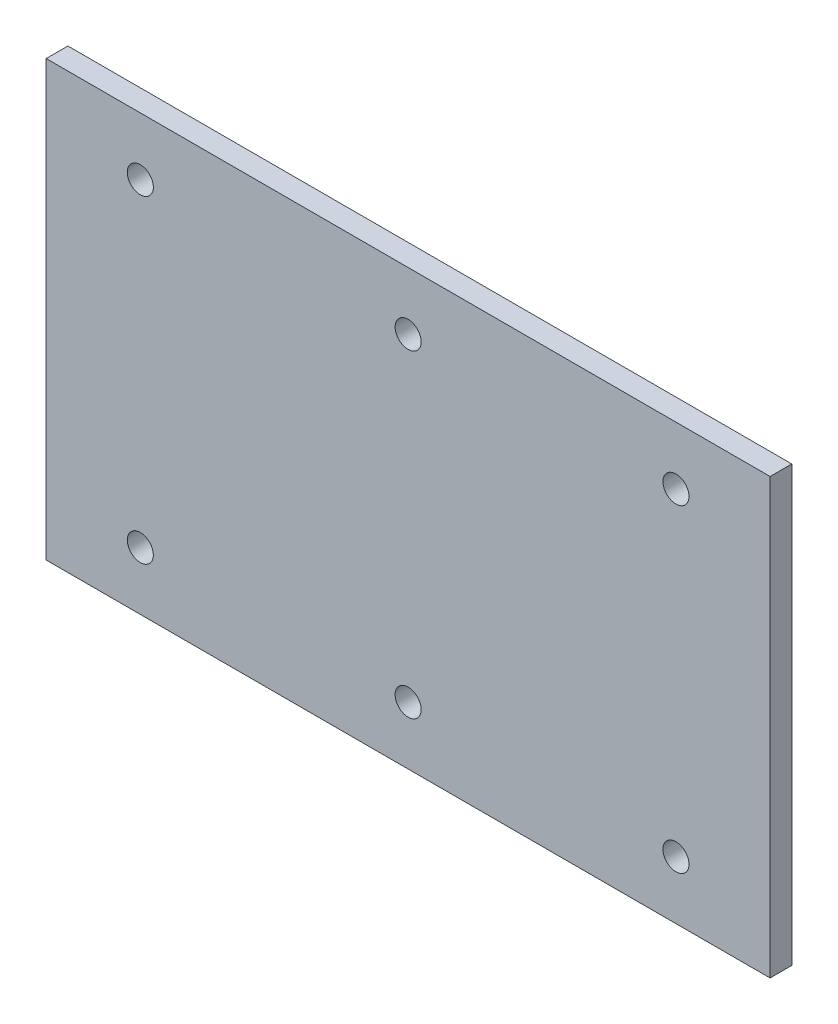
ISO-10303-21;
HEADER;
FILE_DESCRIPTION(('STEP AP214'),'2;1');
FILE_NAME('part.step','',(''),(''),'','','');
FILE_SCHEMA(('AUTOMOTIVE_DESIGN { 1 0 10303 214 1 1 1 1 }'));
ENDSEC;
DATA;
#1=APPLICATION_CONTEXT('core data for automotive mechanical design processes');
#2=APPLICATION_PROTOCOL_DEFINITION('international standard','automotive_design',2000,#1);
#3=PRODUCT_CONTEXT('',#1,'mechanical');
#4=PRODUCT('Part','Part','',(#3));
#5=PRODUCT_RELATED_PRODUCT_CATEGORY('part','',(#4));
#6=PRODUCT_DEFINITION_FORMATION('','',#4);
#7=PRODUCT_DEFINITION_CONTEXT('part definition',#1,'design');
#8=PRODUCT_DEFINITION('design','',#6,#7);
#9=PRODUCT_DEFINITION_SHAPE('','',#8);
#10=(LENGTH_UNIT() NAMED_UNIT(*) SI_UNIT(.MILLI.,.METRE.));
#11=(NAMED_UNIT(*) PLANE_ANGLE_UNIT() SI_UNIT($,.RADIAN.));
#12=(NAMED_UNIT(*) SI_UNIT($,.STERADIAN.) SOLID_ANGLE_UNIT());
#13=UNCERTAINTY_MEASURE_WITH_UNIT(LENGTH_MEASURE(1.E-05),#10,'distance_accuracy_value','');
#14=(GEOMETRIC_REPRESENTATION_CONTEXT(3) GLOBAL_UNCERTAINTY_ASSIGNED_CONTEXT((#13)) GLOBAL_UNIT_ASSIGNED_CONTEXT((#10,
#11,#12)) REPRESENTATION_CONTEXT('',''));
#15=CARTESIAN_POINT('',(0.,0.,0.));
#16=DIRECTION('',(0.,0.,1.));
#17=DIRECTION('',(1.,0.,0.));
#18=AXIS2_PLACEMENT_3D('',#15,#16,#17);
#19=CARTESIAN_POINT('',(185.,110.,-0.09999999999999));
#20=DIRECTION('',(0.,0.,-1.));
#21=DIRECTION('',(1.,0.,0.));
#22=AXIS2_PLACEMENT_3D('',#19,#20,#21);
#23=CYLINDRICAL_SURFACE('',#22,9.);
#24=CARTESIAN_POINT('',(185.,110.,0.));
#25=DIRECTION('',(0.,0.,-1.));
#26=DIRECTION('',(1.,0.,0.));
#27=AXIS2_PLACEMENT_3D('',#24,#25,#26);
#28=CIRCLE('',#27,9.);
#29=CARTESIAN_POINT('',(194.,110.,0.));
#30=VERTEX_POINT('',#29);
#31=EDGE_CURVE('E212',#30,#30,#28,.T.);
#32=ORIENTED_EDGE('',*,*,#31,.T.);
#33=DIRECTION('',(0.,0.,1.));
#34=VECTOR('',#33,1.);
#35=CARTESIAN_POINT('',(194.,110.,-0.09999999999999));
#36=LINE('',#35,#34);
#37=CARTESIAN_POINT('',(194.,110.,15.));
#38=VERTEX_POINT('',#37);
#39=EDGE_CURVE('E11',#30,#38,#36,.T.);
#40=ORIENTED_EDGE('',*,*,#39,.T.);
#41=CARTESIAN_POINT('',(185.,110.,15.));
#42=DIRECTION('',(0.,0.,-1.));
#43=DIRECTION('',(1.,0.,0.));
#44=AXIS2_PLACEMENT_3D('',#41,#42,#43);
#45=CIRCLE('',#44,9.);
#46=EDGE_CURVE('E174',#38,#38,#45,.T.);
#47=ORIENTED_EDGE('',*,*,#46,.F.);
#48=ORIENTED_EDGE('',*,*,#39,.F.);
#49=EDGE_LOOP('',(#32,#40,#47,#48));
#50=FACE_BOUND('',#49,.T.);
#51=ADVANCED_FACE('F17',(#50),#23,.F.);
#52=CARTESIAN_POINT('',(-2.273736754432E-13,110.,-0.09999999999999));
#53=DIRECTION('',(0.,0.,-1.));
#54=DIRECTION('',(1.,0.,0.));
#55=AXIS2_PLACEMENT_3D('',#52,#53,#54);
#56=CYLINDRICAL_SURFACE('',#55,9.);
#57=CARTESIAN_POINT('',(-2.273736754432E-13,110.,0.));
#58=DIRECTION('',(0.,0.,-1.));
#59=DIRECTION('',(1.,0.,0.));
#60=AXIS2_PLACEMENT_3D('',#57,#58,#59);
#61=CIRCLE('',#60,9.);
#62=CARTESIAN_POINT('',(9.,110.,0.));
#63=VERTEX_POINT('',#62);
#64=EDGE_CURVE('E209',#63,#63,#61,.T.);
#65=ORIENTED_EDGE('',*,*,#64,.T.);
#66=DIRECTION('',(0.,0.,1.));
#67=VECTOR('',#66,1.);
#68=CARTESIAN_POINT('',(9.,110.,-0.09999999999999));
#69=LINE('',#68,#67);
#70=CARTESIAN_POINT('',(9.,110.,15.));
#71=VERTEX_POINT('',#70);
#72=EDGE_CURVE('E20',#63,#71,#69,.T.);
#73=ORIENTED_EDGE('',*,*,#72,.T.);
#74=CARTESIAN_POINT('',(-2.273736754432E-13,110.,15.));
#75=DIRECTION('',(0.,0.,-1.));
#76=DIRECTION('',(1.,0.,0.));
#77=AXIS2_PLACEMENT_3D('',#74,#75,#76);
#78=CIRCLE('',#77,9.);
#79=EDGE_CURVE('E170',#71,#71,#78,.T.);
#80=ORIENTED_EDGE('',*,*,#79,.F.);
#81=ORIENTED_EDGE('',*,*,#72,.F.);
#82=EDGE_LOOP('',(#65,#73,#80,#81));
#83=FACE_BOUND('',#82,.T.);
#84=ADVANCED_FACE('F234',(#83),#56,.F.);
#85=CARTESIAN_POINT('',(-185.,110.,-0.09999999999999));
#86=DIRECTION('',(0.,0.,-1.));
#87=DIRECTION('',(1.,0.,0.));
#88=AXIS2_PLACEMENT_3D('',#85,#86,#87);
#89=CYLINDRICAL_SURFACE('',#88,9.);
#90=CARTESIAN_POINT('',(-185.,110.,0.));
#91=DIRECTION('',(0.,0.,-1.));
#92=DIRECTION('',(1.,0.,0.));
#93=AXIS2_PLACEMENT_3D('',#90,#91,#92);
#94=CIRCLE('',#93,9.);
#95=CARTESIAN_POINT('',(-176.,110.,0.));
#96=VERTEX_POINT('',#95);
#97=EDGE_CURVE('E208',#96,#96,#94,.T.);
#98=ORIENTED_EDGE('',*,*,#97,.T.);
#99=DIRECTION('',(0.,0.,1.));
#100=VECTOR('',#99,1.);
#101=CARTESIAN_POINT('',(-176.,110.,-0.09999999999999));
#102=LINE('',#101,#100);
#103=CARTESIAN_POINT('',(-176.,110.,15.));
#104=VERTEX_POINT('',#103);
#105=EDGE_CURVE('E226',#96,#104,#102,.T.);
#106=ORIENTED_EDGE('',*,*,#105,.T.);
#107=CARTESIAN_POINT('',(-185.,110.,15.));
#108=DIRECTION('',(0.,0.,-1.));
#109=DIRECTION('',(1.,0.,0.));
#110=AXIS2_PLACEMENT_3D('',#107,#108,#109);
#111=CIRCLE('',#110,9.);
#112=EDGE_CURVE('E159',#104,#104,#111,.T.);
#113=ORIENTED_EDGE('',*,*,#112,.F.);
#114=ORIENTED_EDGE('',*,*,#105,.F.);
#115=EDGE_LOOP('',(#98,#106,#113,#114));
#116=FACE_BOUND('',#115,.T.);
#117=ADVANCED_FACE('F281',(#116),#89,.F.);
#118=CARTESIAN_POINT('',(185.,-110.,-0.09999999999999));
#119=DIRECTION('',(0.,0.,-1.));
#120=DIRECTION('',(1.,0.,0.));
#121=AXIS2_PLACEMENT_3D('',#118,#119,#120);
#122=CYLINDRICAL_SURFACE('',#121,9.);
#123=CARTESIAN_POINT('',(185.,-110.,0.));
#124=DIRECTION('',(0.,0.,-1.));
#125=DIRECTION('',(1.,0.,0.));
#126=AXIS2_PLACEMENT_3D('',#123,#124,#125);
#127=CIRCLE('',#126,9.);
#128=CARTESIAN_POINT('',(194.,-110.,0.));
#129=VERTEX_POINT('',#128);
#130=EDGE_CURVE('E204',#129,#129,#127,.T.);
#131=ORIENTED_EDGE('',*,*,#130,.T.);
#132=DIRECTION('',(0.,0.,1.));
#133=VECTOR('',#132,1.);
#134=CARTESIAN_POINT('',(194.,-110.,-0.09999999999999));
#135=LINE('',#134,#133);
#136=CARTESIAN_POINT('',(194.,-110.,15.));
#137=VERTEX_POINT('',#136);
#138=EDGE_CURVE('E224',#129,#137,#135,.T.);
#139=ORIENTED_EDGE('',*,*,#138,.T.);
#140=CARTESIAN_POINT('',(185.,-110.,15.));
#141=DIRECTION('',(0.,0.,-1.));
#142=DIRECTION('',(1.,0.,0.));
#143=AXIS2_PLACEMENT_3D('',#140,#141,#142);
#144=CIRCLE('',#143,9.);
#145=EDGE_CURVE('E157',#137,#137,#144,.T.);
#146=ORIENTED_EDGE('',*,*,#145,.F.);
#147=ORIENTED_EDGE('',*,*,#138,.F.);
#148=EDGE_LOOP('',(#131,#139,#146,#147));
#149=FACE_BOUND('',#148,.T.);
#150=ADVANCED_FACE('F287',(#149),#122,.F.);
#151=CARTESIAN_POINT('',(-2.273736754432E-13,-110.,-0.09999999999999));
#152=DIRECTION('',(0.,0.,-1.));
#153=DIRECTION('',(1.,0.,0.));
#154=AXIS2_PLACEMENT_3D('',#151,#152,#153);
#155=CYLINDRICAL_SURFACE('',#154,9.);
#156=CARTESIAN_POINT('',(-2.273736754432E-13,-110.,0.));
#157=DIRECTION('',(0.,0.,-1.));
#158=DIRECTION('',(1.,0.,0.));
#159=AXIS2_PLACEMENT_3D('',#156,#157,#158);
#160=CIRCLE('',#159,9.);
#161=CARTESIAN_POINT('',(9.,-110.,0.));
#162=VERTEX_POINT('',#161);
#163=EDGE_CURVE('E198',#162,#162,#160,.T.);
#164=ORIENTED_EDGE('',*,*,#163,.T.);
#165=DIRECTION('',(0.,0.,1.));
#166=VECTOR('',#165,1.);
#167=CARTESIAN_POINT('',(9.,-110.,-0.09999999999999));
#168=LINE('',#167,#166);
#169=CARTESIAN_POINT('',(9.,-110.,15.));
#170=VERTEX_POINT('',#169);
#171=EDGE_CURVE('E221',#162,#170,#168,.T.);
#172=ORIENTED_EDGE('',*,*,#171,.T.);
#173=CARTESIAN_POINT('',(-2.273736754432E-13,-110.,15.));
#174=DIRECTION('',(0.,0.,-1.));
#175=DIRECTION('',(1.,0.,0.));
#176=AXIS2_PLACEMENT_3D('',#173,#174,#175);
#177=CIRCLE('',#176,9.);
#178=EDGE_CURVE('E160',#170,#170,#177,.T.);
#179=ORIENTED_EDGE('',*,*,#178,.F.);
#180=ORIENTED_EDGE('',*,*,#171,.F.);
#181=EDGE_LOOP('',(#164,#172,#179,#180));
#182=FACE_BOUND('',#181,.T.);
#183=ADVANCED_FACE('F290',(#182),#155,.F.);
#184=CARTESIAN_POINT('',(-185.,-110.,-0.09999999999999));
#185=DIRECTION('',(0.,0.,-1.));
#186=DIRECTION('',(1.,0.,0.));
#187=AXIS2_PLACEMENT_3D('',#184,#185,#186);
#188=CYLINDRICAL_SURFACE('',#187,9.);
#189=CARTESIAN_POINT('',(-185.,-110.,0.));
#190=DIRECTION('',(0.,0.,-1.));
#191=DIRECTION('',(1.,0.,0.));
#192=AXIS2_PLACEMENT_3D('',#189,#190,#191);
#193=CIRCLE('',#192,9.);
#194=CARTESIAN_POINT('',(-176.,-110.,0.));
#195=VERTEX_POINT('',#194);
#196=EDGE_CURVE('E194',#195,#195,#193,.T.);
#197=ORIENTED_EDGE('',*,*,#196,.T.);
#198=DIRECTION('',(0.,0.,1.));
#199=VECTOR('',#198,1.);
#200=CARTESIAN_POINT('',(-176.,-110.,-0.09999999999999));
#201=LINE('',#200,#199);
#202=CARTESIAN_POINT('',(-176.,-110.,15.));
#203=VERTEX_POINT('',#202);
#204=EDGE_CURVE('E218',#195,#203,#201,.T.);
#205=ORIENTED_EDGE('',*,*,#204,.T.);
#206=CARTESIAN_POINT('',(-185.,-110.,15.));
#207=DIRECTION('',(0.,0.,-1.));
#208=DIRECTION('',(1.,0.,0.));
#209=AXIS2_PLACEMENT_3D('',#206,#207,#208);
#210=CIRCLE('',#209,9.);
#211=EDGE_CURVE('E164',#203,#203,#210,.T.);
#212=ORIENTED_EDGE('',*,*,#211,.F.);
#213=ORIENTED_EDGE('',*,*,#204,.F.);
#214=EDGE_LOOP('',(#197,#205,#212,#213));
#215=FACE_BOUND('',#214,.T.);
#216=ADVANCED_FACE('F271',(#215),#188,.F.);
#217=CARTESIAN_POINT('',(250.,-150.,0.));
#218=DIRECTION('',(1.,0.,0.));
#219=DIRECTION('',(0.,-1.,0.));
#220=AXIS2_PLACEMENT_3D('',#217,#218,#219);
#221=PLANE('',#220);
#222=DIRECTION('',(0.,0.,1.));
#223=VECTOR('',#222,1.);
#224=CARTESIAN_POINT('',(250.,-150.,0.));
#225=LINE('',#224,#223);
#226=CARTESIAN_POINT('',(250.,-150.,0.));
#227=VERTEX_POINT('',#226);
#228=CARTESIAN_POINT('',(250.,-150.,15.));
#229=VERTEX_POINT('',#228);
#230=EDGE_CURVE('E126',#227,#229,#225,.T.);
#231=ORIENTED_EDGE('',*,*,#230,.F.);
#232=DIRECTION('',(0.,1.,0.));
#233=VECTOR('',#232,1.);
#234=CARTESIAN_POINT('',(250.,-150.,0.));
#235=LINE('',#234,#233);
#236=CARTESIAN_POINT('',(250.,150.,0.));
#237=VERTEX_POINT('',#236);
#238=EDGE_CURVE('E193',#227,#237,#235,.T.);
#239=ORIENTED_EDGE('',*,*,#238,.T.);
#240=DIRECTION('',(0.,0.,1.));
#241=VECTOR('',#240,1.);
#242=CARTESIAN_POINT('',(250.,150.,0.));
#243=LINE('',#242,#241);
#244=CARTESIAN_POINT('',(250.,150.,15.));
#245=VERTEX_POINT('',#244);
#246=EDGE_CURVE('E187',#237,#245,#243,.T.);
#247=ORIENTED_EDGE('',*,*,#246,.T.);
#248=DIRECTION('',(0.,1.,0.));
#249=VECTOR('',#248,1.);
#250=CARTESIAN_POINT('',(250.,-150.,15.));
#251=LINE('',#250,#249);
#252=EDGE_CURVE('E165',#229,#245,#251,.T.);
#253=ORIENTED_EDGE('',*,*,#252,.F.);
#254=EDGE_LOOP('',(#231,#239,#247,#253));
#255=FACE_BOUND('',#254,.T.);
#256=ADVANCED_FACE('F257',(#255),#221,.T.);
#257=CARTESIAN_POINT('',(-250.,-150.,0.));
#258=DIRECTION('',(0.,0.,1.));
#259=DIRECTION('',(1.,0.,0.));
#260=AXIS2_PLACEMENT_3D('',#257,#258,#259);
#261=PLANE('',#260);
#262=ORIENTED_EDGE('',*,*,#31,.F.);
#263=EDGE_LOOP('',(#262));
#264=FACE_BOUND('',#263,.T.);
#265=ORIENTED_EDGE('',*,*,#64,.F.);
#266=EDGE_LOOP('',(#265));
#267=FACE_BOUND('',#266,.T.);
#268=ORIENTED_EDGE('',*,*,#97,.F.);
#269=EDGE_LOOP('',(#268));
#270=FACE_BOUND('',#269,.T.);
#271=ORIENTED_EDGE('',*,*,#130,.F.);
#272=EDGE_LOOP('',(#271));
#273=FACE_BOUND('',#272,.T.);
#274=ORIENTED_EDGE('',*,*,#163,.F.);
#275=EDGE_LOOP('',(#274));
#276=FACE_BOUND('',#275,.T.);
#277=ORIENTED_EDGE('',*,*,#196,.F.);
#278=EDGE_LOOP('',(#277));
#279=FACE_BOUND('',#278,.T.);
#280=DIRECTION('',(1.,0.,0.));
#281=VECTOR('',#280,1.);
#282=CARTESIAN_POINT('',(-250.,150.,0.));
#283=LINE('',#282,#281);
#284=CARTESIAN_POINT('',(-250.,150.,0.));
#285=VERTEX_POINT('',#284);
#286=EDGE_CURVE('E183',#285,#237,#283,.T.);
#287=ORIENTED_EDGE('',*,*,#286,.T.);
#288=ORIENTED_EDGE('',*,*,#238,.F.);
#289=DIRECTION('',(1.,0.,0.));
#290=VECTOR('',#289,1.);
#291=CARTESIAN_POINT('',(-250.,-150.,0.));
#292=LINE('',#291,#290);
#293=CARTESIAN_POINT('',(-250.,-150.,0.));
#294=VERTEX_POINT('',#293);
#295=EDGE_CURVE('E131',#294,#227,#292,.T.);
#296=ORIENTED_EDGE('',*,*,#295,.F.);
#297=DIRECTION('',(0.,1.,0.));
#298=VECTOR('',#297,1.);
#299=CARTESIAN_POINT('',(-250.,-150.,0.));
#300=LINE('',#299,#298);
#301=EDGE_CURVE('E139',#294,#285,#300,.T.);
#302=ORIENTED_EDGE('',*,*,#301,.T.);
#303=EDGE_LOOP('',(#287,#288,#296,#302));
#304=FACE_BOUND('',#303,.T.);
#305=ADVANCED_FACE('F260',(#264,#267,#270,#273,#276,#279,#304),#261,.F.);
#306=CARTESIAN_POINT('',(-250.,150.,0.));
#307=DIRECTION('',(0.,1.,0.));
#308=DIRECTION('',(1.,0.,0.));
#309=AXIS2_PLACEMENT_3D('',#306,#307,#308);
#310=PLANE('',#309);
#311=ORIENTED_EDGE('',*,*,#286,.F.);
#312=DIRECTION('',(0.,0.,1.));
#313=VECTOR('',#312,1.);
#314=CARTESIAN_POINT('',(-250.,150.,0.));
#315=LINE('',#314,#313);
#316=CARTESIAN_POINT('',(-250.,150.,15.));
#317=VERTEX_POINT('',#316);
#318=EDGE_CURVE('E147',#285,#317,#315,.T.);
#319=ORIENTED_EDGE('',*,*,#318,.T.);
#320=DIRECTION('',(1.,0.,0.));
#321=VECTOR('',#320,1.);
#322=CARTESIAN_POINT('',(-250.,150.,15.));
#323=LINE('',#322,#321);
#324=EDGE_CURVE('E144',#317,#245,#323,.T.);
#325=ORIENTED_EDGE('',*,*,#324,.T.);
#326=ORIENTED_EDGE('',*,*,#246,.F.);
#327=EDGE_LOOP('',(#311,#319,#325,#326));
#328=FACE_BOUND('',#327,.T.);
#329=ADVANCED_FACE('F239',(#328),#310,.T.);
#330=CARTESIAN_POINT('',(-250.,-150.,15.));
#331=DIRECTION('',(0.,0.,1.));
#332=DIRECTION('',(1.,0.,0.));
#333=AXIS2_PLACEMENT_3D('',#330,#331,#332);
#334=PLANE('',#333);
#335=ORIENTED_EDGE('',*,*,#46,.T.);
#336=EDGE_LOOP('',(#335));
#337=FACE_BOUND('',#336,.T.);
#338=ORIENTED_EDGE('',*,*,#79,.T.);
#339=EDGE_LOOP('',(#338));
#340=FACE_BOUND('',#339,.T.);
#341=ORIENTED_EDGE('',*,*,#112,.T.);
#342=EDGE_LOOP('',(#341));
#343=FACE_BOUND('',#342,.T.);
#344=ORIENTED_EDGE('',*,*,#145,.T.);
#345=EDGE_LOOP('',(#344));
#346=FACE_BOUND('',#345,.T.);
#347=ORIENTED_EDGE('',*,*,#178,.T.);
#348=EDGE_LOOP('',(#347));
#349=FACE_BOUND('',#348,.T.);
#350=ORIENTED_EDGE('',*,*,#211,.T.);
#351=EDGE_LOOP('',(#350));
#352=FACE_BOUND('',#351,.T.);
#353=DIRECTION('',(0.,1.,0.));
#354=VECTOR('',#353,1.);
#355=CARTESIAN_POINT('',(-250.,-150.,15.));
#356=LINE('',#355,#354);
#357=CARTESIAN_POINT('',(-250.,-150.,15.));
#358=VERTEX_POINT('',#357);
#359=EDGE_CURVE('E137',#358,#317,#356,.T.);
#360=ORIENTED_EDGE('',*,*,#359,.F.);
#361=DIRECTION('',(1.,0.,0.));
#362=VECTOR('',#361,1.);
#363=CARTESIAN_POINT('',(-250.,-150.,15.));
#364=LINE('',#363,#362);
#365=EDGE_CURVE('E119',#358,#229,#364,.T.);
#366=ORIENTED_EDGE('',*,*,#365,.T.);
#367=ORIENTED_EDGE('',*,*,#252,.T.);
#368=ORIENTED_EDGE('',*,*,#324,.F.);
#369=EDGE_LOOP('',(#360,#366,#367,#368));
#370=FACE_BOUND('',#369,.T.);
#371=ADVANCED_FACE('F142',(#337,#340,#343,#346,#349,#352,#370),#334,.T.);
#372=CARTESIAN_POINT('',(-250.,-150.,0.));
#373=DIRECTION('',(0.,1.,0.));
#374=DIRECTION('',(1.,0.,0.));
#375=AXIS2_PLACEMENT_3D('',#372,#373,#374);
#376=PLANE('',#375);
#377=ORIENTED_EDGE('',*,*,#230,.T.);
#378=ORIENTED_EDGE('',*,*,#365,.F.);
#379=DIRECTION('',(0.,0.,1.));
#380=VECTOR('',#379,1.);
#381=CARTESIAN_POINT('',(-250.,-150.,0.));
#382=LINE('',#381,#380);
#383=EDGE_CURVE('E123',#294,#358,#382,.T.);
#384=ORIENTED_EDGE('',*,*,#383,.F.);
#385=ORIENTED_EDGE('',*,*,#295,.T.);
#386=EDGE_LOOP('',(#377,#378,#384,#385));
#387=FACE_BOUND('',#386,.T.);
#388=ADVANCED_FACE('F121',(#387),#376,.F.);
#389=CARTESIAN_POINT('',(-250.,-150.,0.));
#390=DIRECTION('',(1.,0.,0.));
#391=DIRECTION('',(0.,-1.,0.));
#392=AXIS2_PLACEMENT_3D('',#389,#390,#391);
#393=PLANE('',#392);
#394=ORIENTED_EDGE('',*,*,#359,.T.);
#395=ORIENTED_EDGE('',*,*,#318,.F.);
#396=ORIENTED_EDGE('',*,*,#301,.F.);
#397=ORIENTED_EDGE('',*,*,#383,.T.);
#398=EDGE_LOOP('',(#394,#395,#396,#397));
#399=FACE_BOUND('',#398,.T.);
#400=ADVANCED_FACE('F135',(#399),#393,.F.);
#401=CLOSED_SHELL('',(#51,#84,#117,#150,#183,#216,#256,#305,#329,#371,#388,#400));
#402=MANIFOLD_SOLID_BREP('B1',#401);
#403=ADVANCED_BREP_SHAPE_REPRESENTATION('',(#18,#402),#14);
#404=SHAPE_DEFINITION_REPRESENTATION(#9,#403);
ENDSEC;
END-ISO-10303-21;
